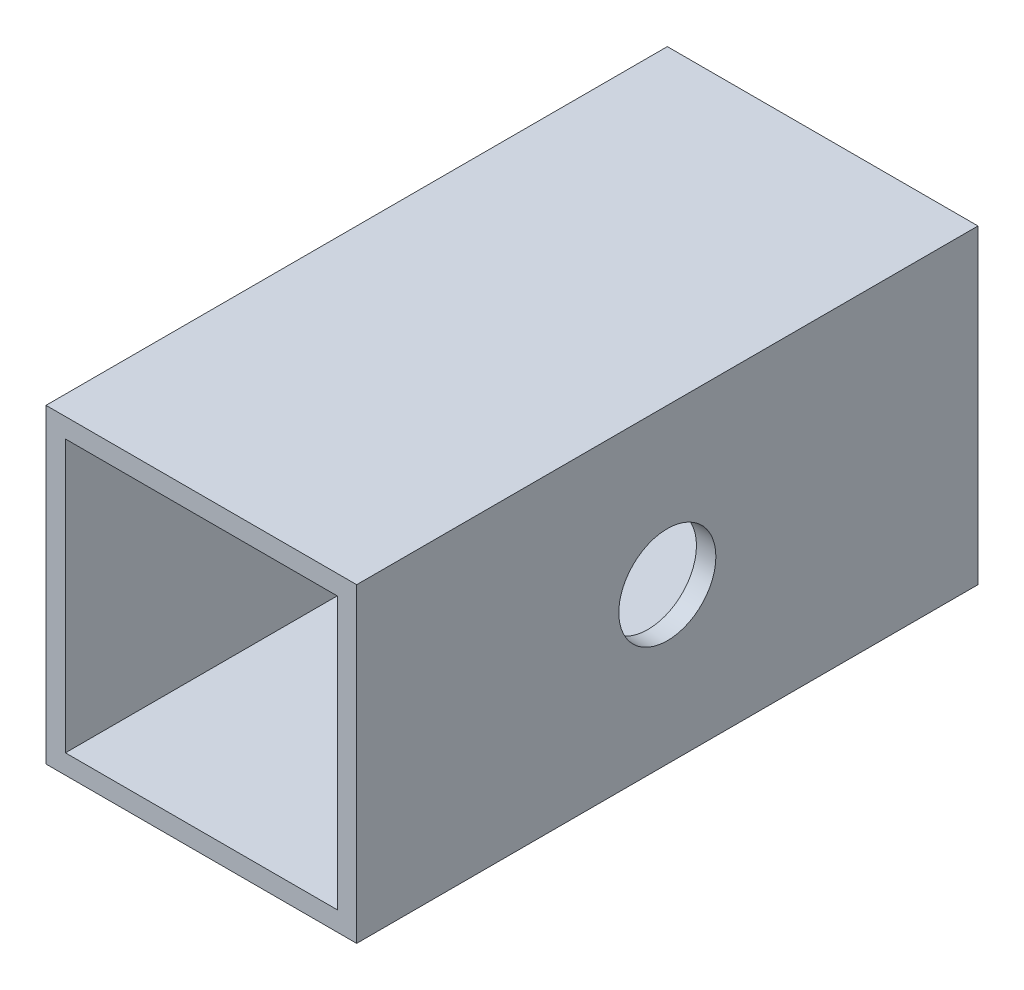
ISO-10303-21;
HEADER;
FILE_DESCRIPTION(('STEP AP214'),'2;1');
FILE_NAME('part.step','',(''),(''),'','','');
FILE_SCHEMA(('AUTOMOTIVE_DESIGN { 1 0 10303 214 1 1 1 1 }'));
ENDSEC;
DATA;
#1=APPLICATION_CONTEXT('core data for automotive mechanical design processes');
#2=APPLICATION_PROTOCOL_DEFINITION('international standard','automotive_design',2000,#1);
#3=PRODUCT_CONTEXT('',#1,'mechanical');
#4=PRODUCT('Part','Part','',(#3));
#5=PRODUCT_RELATED_PRODUCT_CATEGORY('part','',(#4));
#6=PRODUCT_DEFINITION_FORMATION('','',#4);
#7=PRODUCT_DEFINITION_CONTEXT('part definition',#1,'design');
#8=PRODUCT_DEFINITION('design','',#6,#7);
#9=PRODUCT_DEFINITION_SHAPE('','',#8);
#10=(LENGTH_UNIT() NAMED_UNIT(*) SI_UNIT(.MILLI.,.METRE.));
#11=(NAMED_UNIT(*) PLANE_ANGLE_UNIT() SI_UNIT($,.RADIAN.));
#12=(NAMED_UNIT(*) SI_UNIT($,.STERADIAN.) SOLID_ANGLE_UNIT());
#13=UNCERTAINTY_MEASURE_WITH_UNIT(LENGTH_MEASURE(1.E-05),#10,'distance_accuracy_value','');
#14=(GEOMETRIC_REPRESENTATION_CONTEXT(3) GLOBAL_UNCERTAINTY_ASSIGNED_CONTEXT((#13)) GLOBAL_UNIT_ASSIGNED_CONTEXT((#10,
#11,#12)) REPRESENTATION_CONTEXT('',''));
#15=CARTESIAN_POINT('',(0.,0.,0.));
#16=DIRECTION('',(0.,0.,1.));
#17=DIRECTION('',(1.,0.,0.));
#18=AXIS2_PLACEMENT_3D('',#15,#16,#17);
#19=CARTESIAN_POINT('',(0.,0.,50.8));
#20=DIRECTION('',(0.,0.,-1.));
#21=DIRECTION('',(-1.,0.,0.));
#22=AXIS2_PLACEMENT_3D('',#19,#20,#21);
#23=PLANE('',#22);
#24=DIRECTION('',(0.,1.,0.));
#25=VECTOR('',#24,1.);
#26=CARTESIAN_POINT('',(12.7,-12.7,50.8));
#27=LINE('',#26,#25);
#28=CARTESIAN_POINT('',(12.7,-12.7,50.8));
#29=VERTEX_POINT('',#28);
#30=CARTESIAN_POINT('',(12.7,12.7,50.8));
#31=VERTEX_POINT('',#30);
#32=EDGE_CURVE('E136',#29,#31,#27,.T.);
#33=ORIENTED_EDGE('',*,*,#32,.T.);
#34=DIRECTION('',(-1.,0.,0.));
#35=VECTOR('',#34,1.);
#36=CARTESIAN_POINT('',(-12.7,12.7,50.8));
#37=LINE('',#36,#35);
#38=CARTESIAN_POINT('',(-12.7,12.7,50.8));
#39=VERTEX_POINT('',#38);
#40=EDGE_CURVE('E139',#31,#39,#37,.T.);
#41=ORIENTED_EDGE('',*,*,#40,.T.);
#42=DIRECTION('',(0.,-1.,0.));
#43=VECTOR('',#42,1.);
#44=CARTESIAN_POINT('',(-12.7,-12.7,50.8));
#45=LINE('',#44,#43);
#46=CARTESIAN_POINT('',(-12.7,-12.7,50.8));
#47=VERTEX_POINT('',#46);
#48=EDGE_CURVE('E142',#39,#47,#45,.T.);
#49=ORIENTED_EDGE('',*,*,#48,.T.);
#50=DIRECTION('',(1.,0.,0.));
#51=VECTOR('',#50,1.);
#52=CARTESIAN_POINT('',(-12.7,-12.7,50.8));
#53=LINE('',#52,#51);
#54=EDGE_CURVE('E144',#47,#29,#53,.T.);
#55=ORIENTED_EDGE('',*,*,#54,.T.);
#56=EDGE_LOOP('',(#33,#41,#49,#55));
#57=FACE_BOUND('',#56,.T.);
#58=DIRECTION('',(0.,1.,0.));
#59=VECTOR('',#58,1.);
#60=CARTESIAN_POINT('',(11.1125,-11.1125,50.8));
#61=LINE('',#60,#59);
#62=CARTESIAN_POINT('',(11.1125,-11.1125,50.8));
#63=VERTEX_POINT('',#62);
#64=CARTESIAN_POINT('',(11.1125,11.1125,50.8));
#65=VERTEX_POINT('',#64);
#66=EDGE_CURVE('E98',#63,#65,#61,.T.);
#67=ORIENTED_EDGE('',*,*,#66,.F.);
#68=DIRECTION('',(1.,0.,0.));
#69=VECTOR('',#68,1.);
#70=CARTESIAN_POINT('',(-11.1125,-11.1125,50.8));
#71=LINE('',#70,#69);
#72=CARTESIAN_POINT('',(-11.1125,-11.1125,50.8));
#73=VERTEX_POINT('',#72);
#74=EDGE_CURVE('E120',#73,#63,#71,.T.);
#75=ORIENTED_EDGE('',*,*,#74,.F.);
#76=DIRECTION('',(0.,-1.,0.));
#77=VECTOR('',#76,1.);
#78=CARTESIAN_POINT('',(-11.1125,-11.1125,50.8));
#79=LINE('',#78,#77);
#80=CARTESIAN_POINT('',(-11.1125,11.1125,50.8));
#81=VERTEX_POINT('',#80);
#82=EDGE_CURVE('E118',#81,#73,#79,.T.);
#83=ORIENTED_EDGE('',*,*,#82,.F.);
#84=DIRECTION('',(-1.,0.,0.));
#85=VECTOR('',#84,1.);
#86=CARTESIAN_POINT('',(-11.1125,11.1125,50.8));
#87=LINE('',#86,#85);
#88=EDGE_CURVE('E106',#65,#81,#87,.T.);
#89=ORIENTED_EDGE('',*,*,#88,.F.);
#90=EDGE_LOOP('',(#67,#75,#83,#89));
#91=FACE_BOUND('',#90,.T.);
#92=ADVANCED_FACE('F32',(#57,#91),#23,.F.);
#93=CARTESIAN_POINT('',(0.,0.,0.));
#94=DIRECTION('',(0.,0.,-1.));
#95=DIRECTION('',(-1.,0.,0.));
#96=AXIS2_PLACEMENT_3D('',#93,#94,#95);
#97=PLANE('',#96);
#98=DIRECTION('',(0.,1.,0.));
#99=VECTOR('',#98,1.);
#100=CARTESIAN_POINT('',(12.7,-12.7,0.));
#101=LINE('',#100,#99);
#102=CARTESIAN_POINT('',(12.7,-12.7,0.));
#103=VERTEX_POINT('',#102);
#104=CARTESIAN_POINT('',(12.7,12.7,0.));
#105=VERTEX_POINT('',#104);
#106=EDGE_CURVE('E114',#103,#105,#101,.T.);
#107=ORIENTED_EDGE('',*,*,#106,.F.);
#108=DIRECTION('',(1.,0.,0.));
#109=VECTOR('',#108,1.);
#110=CARTESIAN_POINT('',(-12.7,-12.7,0.));
#111=LINE('',#110,#109);
#112=CARTESIAN_POINT('',(-12.7,-12.7,0.));
#113=VERTEX_POINT('',#112);
#114=EDGE_CURVE('E140',#113,#103,#111,.T.);
#115=ORIENTED_EDGE('',*,*,#114,.F.);
#116=DIRECTION('',(0.,-1.,0.));
#117=VECTOR('',#116,1.);
#118=CARTESIAN_POINT('',(-12.7,-12.7,0.));
#119=LINE('',#118,#117);
#120=CARTESIAN_POINT('',(-12.7,12.7,0.));
#121=VERTEX_POINT('',#120);
#122=EDGE_CURVE('E151',#121,#113,#119,.T.);
#123=ORIENTED_EDGE('',*,*,#122,.F.);
#124=DIRECTION('',(-1.,0.,0.));
#125=VECTOR('',#124,1.);
#126=CARTESIAN_POINT('',(-12.7,12.7,0.));
#127=LINE('',#126,#125);
#128=EDGE_CURVE('E149',#105,#121,#127,.T.);
#129=ORIENTED_EDGE('',*,*,#128,.F.);
#130=EDGE_LOOP('',(#107,#115,#123,#129));
#131=FACE_BOUND('',#130,.T.);
#132=DIRECTION('',(1.,0.,0.));
#133=VECTOR('',#132,1.);
#134=CARTESIAN_POINT('',(-11.1125,-11.1125,0.));
#135=LINE('',#134,#133);
#136=CARTESIAN_POINT('',(-11.1125,-11.1125,0.));
#137=VERTEX_POINT('',#136);
#138=CARTESIAN_POINT('',(11.1125,-11.1125,0.));
#139=VERTEX_POINT('',#138);
#140=EDGE_CURVE('E107',#137,#139,#135,.T.);
#141=ORIENTED_EDGE('',*,*,#140,.T.);
#142=DIRECTION('',(0.,1.,0.));
#143=VECTOR('',#142,1.);
#144=CARTESIAN_POINT('',(11.1125,-11.1125,0.));
#145=LINE('',#144,#143);
#146=CARTESIAN_POINT('',(11.1125,11.1125,0.));
#147=VERTEX_POINT('',#146);
#148=EDGE_CURVE('E56',#139,#147,#145,.T.);
#149=ORIENTED_EDGE('',*,*,#148,.T.);
#150=DIRECTION('',(-1.,0.,0.));
#151=VECTOR('',#150,1.);
#152=CARTESIAN_POINT('',(-11.1125,11.1125,0.));
#153=LINE('',#152,#151);
#154=CARTESIAN_POINT('',(-11.1125,11.1125,0.));
#155=VERTEX_POINT('',#154);
#156=EDGE_CURVE('E113',#147,#155,#153,.T.);
#157=ORIENTED_EDGE('',*,*,#156,.T.);
#158=DIRECTION('',(0.,-1.,0.));
#159=VECTOR('',#158,1.);
#160=CARTESIAN_POINT('',(-11.1125,-11.1125,0.));
#161=LINE('',#160,#159);
#162=EDGE_CURVE('E128',#155,#137,#161,.T.);
#163=ORIENTED_EDGE('',*,*,#162,.T.);
#164=EDGE_LOOP('',(#141,#149,#157,#163));
#165=FACE_BOUND('',#164,.T.);
#166=ADVANCED_FACE('F170',(#131,#165),#97,.T.);
#167=CARTESIAN_POINT('',(12.7,-12.7,50.8));
#168=DIRECTION('',(-1.,0.,0.));
#169=DIRECTION('',(0.,0.,1.));
#170=AXIS2_PLACEMENT_3D('',#167,#168,#169);
#171=PLANE('',#170);
#172=CARTESIAN_POINT('',(12.7,0.,25.4));
#173=DIRECTION('',(1.,0.,0.));
#174=DIRECTION('',(0.,0.,-1.));
#175=AXIS2_PLACEMENT_3D('',#172,#173,#174);
#176=CIRCLE('',#175,3.96875);
#177=CARTESIAN_POINT('',(12.7,0.,21.43125));
#178=VERTEX_POINT('',#177);
#179=EDGE_CURVE('E213',#178,#178,#176,.T.);
#180=ORIENTED_EDGE('',*,*,#179,.F.);
#181=EDGE_LOOP('',(#180));
#182=FACE_BOUND('',#181,.T.);
#183=ORIENTED_EDGE('',*,*,#106,.T.);
#184=DIRECTION('',(0.,0.,-1.));
#185=VECTOR('',#184,1.);
#186=CARTESIAN_POINT('',(12.7,12.7,50.8));
#187=LINE('',#186,#185);
#188=EDGE_CURVE('E11',#31,#105,#187,.T.);
#189=ORIENTED_EDGE('',*,*,#188,.F.);
#190=ORIENTED_EDGE('',*,*,#32,.F.);
#191=DIRECTION('',(0.,0.,-1.));
#192=VECTOR('',#191,1.);
#193=CARTESIAN_POINT('',(12.7,-12.7,50.8));
#194=LINE('',#193,#192);
#195=EDGE_CURVE('E146',#29,#103,#194,.T.);
#196=ORIENTED_EDGE('',*,*,#195,.T.);
#197=EDGE_LOOP('',(#183,#189,#190,#196));
#198=FACE_BOUND('',#197,.T.);
#199=ADVANCED_FACE('F34',(#182,#198),#171,.F.);
#200=CARTESIAN_POINT('',(-12.7,12.7,50.8));
#201=DIRECTION('',(0.,-1.,0.));
#202=DIRECTION('',(0.,0.,-1.));
#203=AXIS2_PLACEMENT_3D('',#200,#201,#202);
#204=PLANE('',#203);
#205=ORIENTED_EDGE('',*,*,#128,.T.);
#206=DIRECTION('',(0.,0.,-1.));
#207=VECTOR('',#206,1.);
#208=CARTESIAN_POINT('',(-12.7,12.7,50.8));
#209=LINE('',#208,#207);
#210=EDGE_CURVE('E41',#39,#121,#209,.T.);
#211=ORIENTED_EDGE('',*,*,#210,.F.);
#212=ORIENTED_EDGE('',*,*,#40,.F.);
#213=ORIENTED_EDGE('',*,*,#188,.T.);
#214=EDGE_LOOP('',(#205,#211,#212,#213));
#215=FACE_BOUND('',#214,.T.);
#216=ADVANCED_FACE('F180',(#215),#204,.F.);
#217=CARTESIAN_POINT('',(-12.7,-12.7,50.8));
#218=DIRECTION('',(1.,0.,0.));
#219=DIRECTION('',(0.,1.,0.));
#220=AXIS2_PLACEMENT_3D('',#217,#218,#219);
#221=PLANE('',#220);
#222=CARTESIAN_POINT('',(-12.7,0.,25.4));
#223=DIRECTION('',(1.,0.,0.));
#224=DIRECTION('',(0.,0.,-1.));
#225=AXIS2_PLACEMENT_3D('',#222,#223,#224);
#226=CIRCLE('',#225,3.96875);
#227=CARTESIAN_POINT('',(-12.7,0.,21.43125));
#228=VERTEX_POINT('',#227);
#229=EDGE_CURVE('E211',#228,#228,#226,.T.);
#230=ORIENTED_EDGE('',*,*,#229,.T.);
#231=EDGE_LOOP('',(#230));
#232=FACE_BOUND('',#231,.T.);
#233=ORIENTED_EDGE('',*,*,#122,.T.);
#234=DIRECTION('',(0.,0.,-1.));
#235=VECTOR('',#234,1.);
#236=CARTESIAN_POINT('',(-12.7,-12.7,50.8));
#237=LINE('',#236,#235);
#238=EDGE_CURVE('E156',#47,#113,#237,.T.);
#239=ORIENTED_EDGE('',*,*,#238,.F.);
#240=ORIENTED_EDGE('',*,*,#48,.F.);
#241=ORIENTED_EDGE('',*,*,#210,.T.);
#242=EDGE_LOOP('',(#233,#239,#240,#241));
#243=FACE_BOUND('',#242,.T.);
#244=ADVANCED_FACE('F164',(#232,#243),#221,.F.);
#245=CARTESIAN_POINT('',(-12.7,-12.7,50.8));
#246=DIRECTION('',(0.,1.,0.));
#247=DIRECTION('',(0.,0.,1.));
#248=AXIS2_PLACEMENT_3D('',#245,#246,#247);
#249=PLANE('',#248);
#250=ORIENTED_EDGE('',*,*,#114,.T.);
#251=ORIENTED_EDGE('',*,*,#195,.F.);
#252=ORIENTED_EDGE('',*,*,#54,.F.);
#253=ORIENTED_EDGE('',*,*,#238,.T.);
#254=EDGE_LOOP('',(#250,#251,#252,#253));
#255=FACE_BOUND('',#254,.T.);
#256=ADVANCED_FACE('F174',(#255),#249,.F.);
#257=CARTESIAN_POINT('',(11.1125,-11.1125,50.8));
#258=DIRECTION('',(-1.,0.,0.));
#259=DIRECTION('',(0.,0.,1.));
#260=AXIS2_PLACEMENT_3D('',#257,#258,#259);
#261=PLANE('',#260);
#262=CARTESIAN_POINT('',(11.1125,0.,25.4));
#263=DIRECTION('',(-1.,0.,0.));
#264=DIRECTION('',(0.,0.,1.));
#265=AXIS2_PLACEMENT_3D('',#262,#263,#264);
#266=CIRCLE('',#265,3.96875);
#267=CARTESIAN_POINT('',(11.1125,0.,29.36875));
#268=VERTEX_POINT('',#267);
#269=EDGE_CURVE('E126',#268,#268,#266,.T.);
#270=ORIENTED_EDGE('',*,*,#269,.F.);
#271=EDGE_LOOP('',(#270));
#272=FACE_BOUND('',#271,.T.);
#273=ORIENTED_EDGE('',*,*,#148,.F.);
#274=DIRECTION('',(0.,0.,-1.));
#275=VECTOR('',#274,1.);
#276=CARTESIAN_POINT('',(11.1125,-11.1125,50.8));
#277=LINE('',#276,#275);
#278=EDGE_CURVE('E102',#63,#139,#277,.T.);
#279=ORIENTED_EDGE('',*,*,#278,.F.);
#280=ORIENTED_EDGE('',*,*,#66,.T.);
#281=DIRECTION('',(0.,0.,-1.));
#282=VECTOR('',#281,1.);
#283=CARTESIAN_POINT('',(11.1125,11.1125,50.8));
#284=LINE('',#283,#282);
#285=EDGE_CURVE('E101',#65,#147,#284,.T.);
#286=ORIENTED_EDGE('',*,*,#285,.T.);
#287=EDGE_LOOP('',(#273,#279,#280,#286));
#288=FACE_BOUND('',#287,.T.);
#289=ADVANCED_FACE('F100',(#272,#288),#261,.T.);
#290=CARTESIAN_POINT('',(-11.1125,11.1125,50.8));
#291=DIRECTION('',(0.,-1.,0.));
#292=DIRECTION('',(0.,0.,-1.));
#293=AXIS2_PLACEMENT_3D('',#290,#291,#292);
#294=PLANE('',#293);
#295=ORIENTED_EDGE('',*,*,#156,.F.);
#296=ORIENTED_EDGE('',*,*,#285,.F.);
#297=ORIENTED_EDGE('',*,*,#88,.T.);
#298=DIRECTION('',(0.,0.,-1.));
#299=VECTOR('',#298,1.);
#300=CARTESIAN_POINT('',(-11.1125,11.1125,50.8));
#301=LINE('',#300,#299);
#302=EDGE_CURVE('E115',#81,#155,#301,.T.);
#303=ORIENTED_EDGE('',*,*,#302,.T.);
#304=EDGE_LOOP('',(#295,#296,#297,#303));
#305=FACE_BOUND('',#304,.T.);
#306=ADVANCED_FACE('F110',(#305),#294,.T.);
#307=CARTESIAN_POINT('',(-11.1125,-11.1125,50.8));
#308=DIRECTION('',(1.,0.,0.));
#309=DIRECTION('',(0.,0.,-1.));
#310=AXIS2_PLACEMENT_3D('',#307,#308,#309);
#311=PLANE('',#310);
#312=CARTESIAN_POINT('',(-11.1125,0.,25.4));
#313=DIRECTION('',(1.,0.,0.));
#314=DIRECTION('',(0.,0.,-1.));
#315=AXIS2_PLACEMENT_3D('',#312,#313,#314);
#316=CIRCLE('',#315,3.96875);
#317=CARTESIAN_POINT('',(-11.1125,0.,21.43125));
#318=VERTEX_POINT('',#317);
#319=EDGE_CURVE('E36',#318,#318,#316,.T.);
#320=ORIENTED_EDGE('',*,*,#319,.F.);
#321=EDGE_LOOP('',(#320));
#322=FACE_BOUND('',#321,.T.);
#323=ORIENTED_EDGE('',*,*,#162,.F.);
#324=ORIENTED_EDGE('',*,*,#302,.F.);
#325=ORIENTED_EDGE('',*,*,#82,.T.);
#326=DIRECTION('',(0.,0.,-1.));
#327=VECTOR('',#326,1.);
#328=CARTESIAN_POINT('',(-11.1125,-11.1125,50.8));
#329=LINE('',#328,#327);
#330=EDGE_CURVE('E48',#73,#137,#329,.T.);
#331=ORIENTED_EDGE('',*,*,#330,.T.);
#332=EDGE_LOOP('',(#323,#324,#325,#331));
#333=FACE_BOUND('',#332,.T.);
#334=ADVANCED_FACE('F206',(#322,#333),#311,.T.);
#335=CARTESIAN_POINT('',(-11.1125,-11.1125,50.8));
#336=DIRECTION('',(0.,1.,0.));
#337=DIRECTION('',(0.,0.,1.));
#338=AXIS2_PLACEMENT_3D('',#335,#336,#337);
#339=PLANE('',#338);
#340=ORIENTED_EDGE('',*,*,#140,.F.);
#341=ORIENTED_EDGE('',*,*,#330,.F.);
#342=ORIENTED_EDGE('',*,*,#74,.T.);
#343=ORIENTED_EDGE('',*,*,#278,.T.);
#344=EDGE_LOOP('',(#340,#341,#342,#343));
#345=FACE_BOUND('',#344,.T.);
#346=ADVANCED_FACE('F222',(#345),#339,.T.);
#347=CARTESIAN_POINT('',(-12.7,0.,25.4));
#348=DIRECTION('',(1.,0.,0.));
#349=DIRECTION('',(0.,0.,-1.));
#350=AXIS2_PLACEMENT_3D('',#347,#348,#349);
#351=CYLINDRICAL_SURFACE('',#350,3.96875);
#352=ORIENTED_EDGE('',*,*,#319,.T.);
#353=EDGE_LOOP('',(#352));
#354=FACE_BOUND('',#353,.T.);
#355=ORIENTED_EDGE('',*,*,#229,.F.);
#356=EDGE_LOOP('',(#355));
#357=FACE_BOUND('',#356,.T.);
#358=ADVANCED_FACE('F219',(#354,#357),#351,.F.);
#359=ORIENTED_EDGE('',*,*,#269,.T.);
#360=EDGE_LOOP('',(#359));
#361=FACE_BOUND('',#360,.T.);
#362=ORIENTED_EDGE('',*,*,#179,.T.);
#363=EDGE_LOOP('',(#362));
#364=FACE_BOUND('',#363,.T.);
#365=ADVANCED_FACE('F221',(#361,#364),#351,.F.);
#366=CLOSED_SHELL('',(#92,#166,#199,#216,#244,#256,#289,#306,#334,#346,#358,#365));
#367=MANIFOLD_SOLID_BREP('B2',#366);
#368=ADVANCED_BREP_SHAPE_REPRESENTATION('',(#18,#367),#14);
#369=SHAPE_DEFINITION_REPRESENTATION(#9,#368);
ENDSEC;
END-ISO-10303-21;
